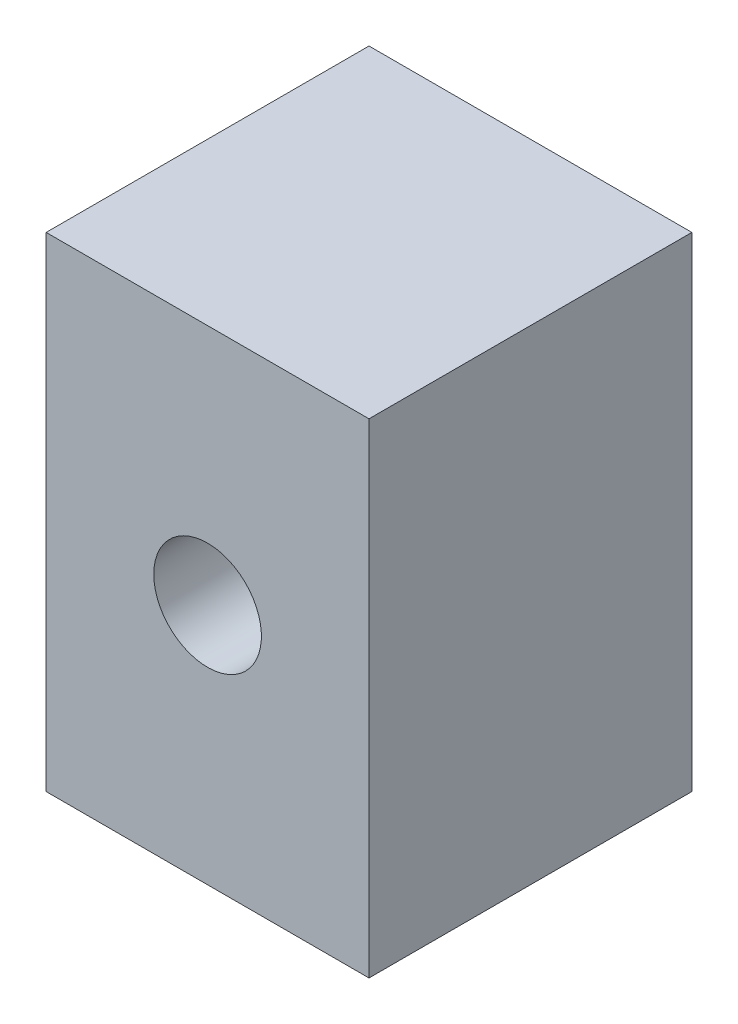
ISO-10303-21;
HEADER;
FILE_DESCRIPTION(('STEP AP214'),'2;1');
FILE_NAME('part.step','',(''),(''),'','','');
FILE_SCHEMA(('AUTOMOTIVE_DESIGN { 1 0 10303 214 1 1 1 1 }'));
ENDSEC;
DATA;
#1=APPLICATION_CONTEXT('core data for automotive mechanical design processes');
#2=APPLICATION_PROTOCOL_DEFINITION('international standard','automotive_design',2000,#1);
#3=PRODUCT_CONTEXT('',#1,'mechanical');
#4=PRODUCT('Part','Part','',(#3));
#5=PRODUCT_RELATED_PRODUCT_CATEGORY('part','',(#4));
#6=PRODUCT_DEFINITION_FORMATION('','',#4);
#7=PRODUCT_DEFINITION_CONTEXT('part definition',#1,'design');
#8=PRODUCT_DEFINITION('design','',#6,#7);
#9=PRODUCT_DEFINITION_SHAPE('','',#8);
#10=(LENGTH_UNIT() NAMED_UNIT(*) SI_UNIT(.MILLI.,.METRE.));
#11=(NAMED_UNIT(*) PLANE_ANGLE_UNIT() SI_UNIT($,.RADIAN.));
#12=(NAMED_UNIT(*) SI_UNIT($,.STERADIAN.) SOLID_ANGLE_UNIT());
#13=UNCERTAINTY_MEASURE_WITH_UNIT(LENGTH_MEASURE(1.E-05),#10,'distance_accuracy_value','');
#14=(GEOMETRIC_REPRESENTATION_CONTEXT(3) GLOBAL_UNCERTAINTY_ASSIGNED_CONTEXT((#13)) GLOBAL_UNIT_ASSIGNED_CONTEXT((#10,
#11,#12)) REPRESENTATION_CONTEXT('',''));
#15=CARTESIAN_POINT('',(0.,0.,0.));
#16=DIRECTION('',(0.,0.,1.));
#17=DIRECTION('',(1.,0.,0.));
#18=AXIS2_PLACEMENT_3D('',#15,#16,#17);
#19=CARTESIAN_POINT('',(0.,0.,38.1));
#20=DIRECTION('',(0.,0.,-1.));
#21=DIRECTION('',(-1.,0.,0.));
#22=AXIS2_PLACEMENT_3D('',#19,#20,#21);
#23=PLANE('',#22);
#24=DIRECTION('',(0.,1.,0.));
#25=VECTOR('',#24,1.);
#26=CARTESIAN_POINT('',(38.1,-57.15,38.1));
#27=LINE('',#26,#25);
#28=CARTESIAN_POINT('',(38.1,-57.15,38.1));
#29=VERTEX_POINT('',#28);
#30=CARTESIAN_POINT('',(38.1,57.15,38.1));
#31=VERTEX_POINT('',#30);
#32=EDGE_CURVE('E85',#29,#31,#27,.T.);
#33=ORIENTED_EDGE('',*,*,#32,.T.);
#34=DIRECTION('',(-1.,0.,0.));
#35=VECTOR('',#34,1.);
#36=CARTESIAN_POINT('',(-38.1,57.15,38.1));
#37=LINE('',#36,#35);
#38=CARTESIAN_POINT('',(-38.1,57.15,38.1));
#39=VERTEX_POINT('',#38);
#40=EDGE_CURVE('E80',#31,#39,#37,.T.);
#41=ORIENTED_EDGE('',*,*,#40,.T.);
#42=DIRECTION('',(0.,-1.,0.));
#43=VECTOR('',#42,1.);
#44=CARTESIAN_POINT('',(-38.1,-57.15,38.1));
#45=LINE('',#44,#43);
#46=CARTESIAN_POINT('',(-38.1,-57.15,38.1));
#47=VERTEX_POINT('',#46);
#48=EDGE_CURVE('E83',#39,#47,#45,.T.);
#49=ORIENTED_EDGE('',*,*,#48,.T.);
#50=DIRECTION('',(1.,0.,0.));
#51=VECTOR('',#50,1.);
#52=CARTESIAN_POINT('',(-38.1,-57.15,38.1));
#53=LINE('',#52,#51);
#54=EDGE_CURVE('E50',#47,#29,#53,.T.);
#55=ORIENTED_EDGE('',*,*,#54,.T.);
#56=EDGE_LOOP('',(#33,#41,#49,#55));
#57=FACE_BOUND('',#56,.T.);
#58=CARTESIAN_POINT('',(0.,0.,38.1));
#59=DIRECTION('',(0.,0.,1.));
#60=DIRECTION('',(1.,0.,0.));
#61=AXIS2_PLACEMENT_3D('',#58,#59,#60);
#62=CIRCLE('',#61,12.7);
#63=CARTESIAN_POINT('',(-12.7,0.,38.1));
#64=VERTEX_POINT('',#63);
#65=EDGE_CURVE('E100',#64,#64,#62,.T.);
#66=ORIENTED_EDGE('',*,*,#65,.F.);
#67=EDGE_LOOP('',(#66));
#68=FACE_BOUND('',#67,.T.);
#69=ADVANCED_FACE('F33',(#57,#68),#23,.F.);
#70=CARTESIAN_POINT('',(0.,0.,-38.1));
#71=DIRECTION('',(0.,0.,-1.));
#72=DIRECTION('',(-1.,0.,0.));
#73=AXIS2_PLACEMENT_3D('',#70,#71,#72);
#74=PLANE('',#73);
#75=DIRECTION('',(0.,1.,0.));
#76=VECTOR('',#75,1.);
#77=CARTESIAN_POINT('',(38.1,-57.15,-38.1));
#78=LINE('',#77,#76);
#79=CARTESIAN_POINT('',(38.1,-57.15,-38.1));
#80=VERTEX_POINT('',#79);
#81=CARTESIAN_POINT('',(38.1,57.15,-38.1));
#82=VERTEX_POINT('',#81);
#83=EDGE_CURVE('E97',#80,#82,#78,.T.);
#84=ORIENTED_EDGE('',*,*,#83,.F.);
#85=DIRECTION('',(1.,0.,0.));
#86=VECTOR('',#85,1.);
#87=CARTESIAN_POINT('',(-38.1,-57.15,-38.1));
#88=LINE('',#87,#86);
#89=CARTESIAN_POINT('',(-38.1,-57.15,-38.1));
#90=VERTEX_POINT('',#89);
#91=EDGE_CURVE('E73',#90,#80,#88,.T.);
#92=ORIENTED_EDGE('',*,*,#91,.F.);
#93=DIRECTION('',(0.,-1.,0.));
#94=VECTOR('',#93,1.);
#95=CARTESIAN_POINT('',(-38.1,-57.15,-38.1));
#96=LINE('',#95,#94);
#97=CARTESIAN_POINT('',(-38.1,57.15,-38.1));
#98=VERTEX_POINT('',#97);
#99=EDGE_CURVE('E67',#98,#90,#96,.T.);
#100=ORIENTED_EDGE('',*,*,#99,.F.);
#101=DIRECTION('',(-1.,0.,0.));
#102=VECTOR('',#101,1.);
#103=CARTESIAN_POINT('',(-38.1,57.15,-38.1));
#104=LINE('',#103,#102);
#105=EDGE_CURVE('E89',#82,#98,#104,.T.);
#106=ORIENTED_EDGE('',*,*,#105,.F.);
#107=EDGE_LOOP('',(#84,#92,#100,#106));
#108=FACE_BOUND('',#107,.T.);
#109=CARTESIAN_POINT('',(0.,0.,-38.1));
#110=DIRECTION('',(0.,0.,1.));
#111=DIRECTION('',(1.,0.,0.));
#112=AXIS2_PLACEMENT_3D('',#109,#110,#111);
#113=CIRCLE('',#112,12.7);
#114=CARTESIAN_POINT('',(-12.7,0.,-38.1));
#115=VERTEX_POINT('',#114);
#116=EDGE_CURVE('E112',#115,#115,#113,.T.);
#117=ORIENTED_EDGE('',*,*,#116,.T.);
#118=EDGE_LOOP('',(#117));
#119=FACE_BOUND('',#118,.T.);
#120=ADVANCED_FACE('F108',(#108,#119),#74,.T.);
#121=CARTESIAN_POINT('',(38.1,-57.15,38.1));
#122=DIRECTION('',(-1.,0.,0.));
#123=DIRECTION('',(0.,0.,1.));
#124=AXIS2_PLACEMENT_3D('',#121,#122,#123);
#125=PLANE('',#124);
#126=ORIENTED_EDGE('',*,*,#83,.T.);
#127=DIRECTION('',(0.,0.,-1.));
#128=VECTOR('',#127,1.);
#129=CARTESIAN_POINT('',(38.1,57.15,38.1));
#130=LINE('',#129,#128);
#131=EDGE_CURVE('E11',#31,#82,#130,.T.);
#132=ORIENTED_EDGE('',*,*,#131,.F.);
#133=ORIENTED_EDGE('',*,*,#32,.F.);
#134=DIRECTION('',(0.,0.,-1.));
#135=VECTOR('',#134,1.);
#136=CARTESIAN_POINT('',(38.1,-57.15,38.1));
#137=LINE('',#136,#135);
#138=EDGE_CURVE('E93',#29,#80,#137,.T.);
#139=ORIENTED_EDGE('',*,*,#138,.T.);
#140=EDGE_LOOP('',(#126,#132,#133,#139));
#141=FACE_BOUND('',#140,.T.);
#142=ADVANCED_FACE('F35',(#141),#125,.F.);
#143=CARTESIAN_POINT('',(-38.1,57.15,38.1));
#144=DIRECTION('',(0.,-1.,0.));
#145=DIRECTION('',(0.,0.,-1.));
#146=AXIS2_PLACEMENT_3D('',#143,#144,#145);
#147=PLANE('',#146);
#148=ORIENTED_EDGE('',*,*,#105,.T.);
#149=DIRECTION('',(0.,0.,-1.));
#150=VECTOR('',#149,1.);
#151=CARTESIAN_POINT('',(-38.1,57.15,38.1));
#152=LINE('',#151,#150);
#153=EDGE_CURVE('E42',#39,#98,#152,.T.);
#154=ORIENTED_EDGE('',*,*,#153,.F.);
#155=ORIENTED_EDGE('',*,*,#40,.F.);
#156=ORIENTED_EDGE('',*,*,#131,.T.);
#157=EDGE_LOOP('',(#148,#154,#155,#156));
#158=FACE_BOUND('',#157,.T.);
#159=ADVANCED_FACE('F88',(#158),#147,.F.);
#160=CARTESIAN_POINT('',(-38.1,-57.15,38.1));
#161=DIRECTION('',(1.,0.,0.));
#162=DIRECTION('',(0.,0.,-1.));
#163=AXIS2_PLACEMENT_3D('',#160,#161,#162);
#164=PLANE('',#163);
#165=ORIENTED_EDGE('',*,*,#99,.T.);
#166=DIRECTION('',(0.,0.,-1.));
#167=VECTOR('',#166,1.);
#168=CARTESIAN_POINT('',(-38.1,-57.15,38.1));
#169=LINE('',#168,#167);
#170=EDGE_CURVE('E90',#47,#90,#169,.T.);
#171=ORIENTED_EDGE('',*,*,#170,.F.);
#172=ORIENTED_EDGE('',*,*,#48,.F.);
#173=ORIENTED_EDGE('',*,*,#153,.T.);
#174=EDGE_LOOP('',(#165,#171,#172,#173));
#175=FACE_BOUND('',#174,.T.);
#176=ADVANCED_FACE('F91',(#175),#164,.F.);
#177=CARTESIAN_POINT('',(-38.1,-57.15,38.1));
#178=DIRECTION('',(0.,1.,0.));
#179=DIRECTION('',(0.,0.,1.));
#180=AXIS2_PLACEMENT_3D('',#177,#178,#179);
#181=PLANE('',#180);
#182=ORIENTED_EDGE('',*,*,#91,.T.);
#183=ORIENTED_EDGE('',*,*,#138,.F.);
#184=ORIENTED_EDGE('',*,*,#54,.F.);
#185=ORIENTED_EDGE('',*,*,#170,.T.);
#186=EDGE_LOOP('',(#182,#183,#184,#185));
#187=FACE_BOUND('',#186,.T.);
#188=ADVANCED_FACE('F105',(#187),#181,.F.);
#189=CARTESIAN_POINT('',(0.,0.,38.1));
#190=DIRECTION('',(0.,0.,-1.));
#191=DIRECTION('',(-1.,0.,0.));
#192=AXIS2_PLACEMENT_3D('',#189,#190,#191);
#193=CYLINDRICAL_SURFACE('',#192,12.7);
#194=CARTESIAN_POINT('',(-12.7,0.,38.1));
#195=CARTESIAN_POINT('',(-12.7,0.,37.30625));
#196=CARTESIAN_POINT('',(-12.7,0.,36.5125));
#197=CARTESIAN_POINT('',(-12.7,0.,34.925));
#198=CARTESIAN_POINT('',(-12.7,0.,34.13125));
#199=CARTESIAN_POINT('',(-12.7,0.,32.54375));
#200=CARTESIAN_POINT('',(-12.7,0.,31.75));
#201=CARTESIAN_POINT('',(-12.7,0.,30.1625));
#202=CARTESIAN_POINT('',(-12.7,0.,29.36875));
#203=CARTESIAN_POINT('',(-12.7,0.,27.78125));
#204=CARTESIAN_POINT('',(-12.7,0.,26.9875));
#205=CARTESIAN_POINT('',(-12.7,0.,25.4));
#206=CARTESIAN_POINT('',(-12.7,0.,24.60625));
#207=CARTESIAN_POINT('',(-12.7,0.,23.01875));
#208=CARTESIAN_POINT('',(-12.7,0.,22.225));
#209=CARTESIAN_POINT('',(-12.7,0.,20.6375));
#210=CARTESIAN_POINT('',(-12.7,0.,19.84375));
#211=CARTESIAN_POINT('',(-12.7,0.,18.25625));
#212=CARTESIAN_POINT('',(-12.7,0.,17.4625));
#213=CARTESIAN_POINT('',(-12.7,0.,15.875));
#214=CARTESIAN_POINT('',(-12.7,0.,15.08125));
#215=CARTESIAN_POINT('',(-12.7,0.,13.49375));
#216=CARTESIAN_POINT('',(-12.7,0.,12.7));
#217=CARTESIAN_POINT('',(-12.7,0.,11.1125));
#218=CARTESIAN_POINT('',(-12.7,0.,10.31875));
#219=CARTESIAN_POINT('',(-12.7,0.,8.73124999999999));
#220=CARTESIAN_POINT('',(-12.7,0.,7.93749999999999));
#221=CARTESIAN_POINT('',(-12.7,0.,6.34999999999999));
#222=CARTESIAN_POINT('',(-12.7,0.,5.55625));
#223=CARTESIAN_POINT('',(-12.7,0.,3.96875));
#224=CARTESIAN_POINT('',(-12.7,0.,3.17499999999999));
#225=CARTESIAN_POINT('',(-12.7,0.,1.58749999999999));
#226=CARTESIAN_POINT('',(-12.7,0.,0.793749999999994));
#227=CARTESIAN_POINT('',(-12.7,0.,-0.793750000000007));
#228=CARTESIAN_POINT('',(-12.7,0.,-1.58750000000001));
#229=CARTESIAN_POINT('',(-12.7,0.,-3.17500000000001));
#230=CARTESIAN_POINT('',(-12.7,0.,-3.96875000000001));
#231=CARTESIAN_POINT('',(-12.7,0.,-5.55625000000001));
#232=CARTESIAN_POINT('',(-12.7,0.,-6.35000000000001));
#233=CARTESIAN_POINT('',(-12.7,0.,-7.93750000000001));
#234=CARTESIAN_POINT('',(-12.7,0.,-8.73125000000001));
#235=CARTESIAN_POINT('',(-12.7,0.,-10.31875));
#236=CARTESIAN_POINT('',(-12.7,0.,-11.1125));
#237=CARTESIAN_POINT('',(-12.7,0.,-12.7));
#238=CARTESIAN_POINT('',(-12.7,0.,-13.49375));
#239=CARTESIAN_POINT('',(-12.7,0.,-15.08125));
#240=CARTESIAN_POINT('',(-12.7,0.,-15.875));
#241=CARTESIAN_POINT('',(-12.7,0.,-17.4625));
#242=CARTESIAN_POINT('',(-12.7,0.,-18.25625));
#243=CARTESIAN_POINT('',(-12.7,0.,-19.84375));
#244=CARTESIAN_POINT('',(-12.7,0.,-20.6375));
#245=CARTESIAN_POINT('',(-12.7,0.,-22.225));
#246=CARTESIAN_POINT('',(-12.7,0.,-23.01875));
#247=CARTESIAN_POINT('',(-12.7,0.,-24.60625));
#248=CARTESIAN_POINT('',(-12.7,0.,-25.4));
#249=CARTESIAN_POINT('',(-12.7,0.,-26.9875));
#250=CARTESIAN_POINT('',(-12.7,0.,-27.78125));
#251=CARTESIAN_POINT('',(-12.7,0.,-29.36875));
#252=CARTESIAN_POINT('',(-12.7,0.,-30.1625));
#253=CARTESIAN_POINT('',(-12.7,0.,-31.75));
#254=CARTESIAN_POINT('',(-12.7,0.,-32.54375));
#255=CARTESIAN_POINT('',(-12.7,0.,-34.13125));
#256=CARTESIAN_POINT('',(-12.7,0.,-34.925));
#257=CARTESIAN_POINT('',(-12.7,0.,-36.5125));
#258=CARTESIAN_POINT('',(-12.7,0.,-37.30625));
#259=CARTESIAN_POINT('',(-12.7,0.,-38.1));
#260=B_SPLINE_CURVE_WITH_KNOTS('',3,(#194,#195,#196,#197,#198,#199,#200,#201,#202,#203,#204,
#205,#206,#207,#208,#209,#210,#211,#212,#213,#214,#215,#216,#217,#218,#219,#220,#221,#222,#223,
#224,#225,#226,#227,#228,#229,#230,#231,#232,#233,#234,#235,#236,#237,#238,#239,#240,#241,#242,
#243,#244,#245,#246,#247,#248,#249,#250,#251,#252,#253,#254,#255,#256,#257,#258,#259),
.UNSPECIFIED.,.F.,.F.,(4,2,2,2,2,2,2,2,2,2,2,2,2,2,2,2,2,2,2,2,2,2,2,2,2,2,2,2,2,2,2,2,4),(0.,
2.38124999999999,4.7625,7.14375,9.525,11.90625,14.2875,16.66875,19.05,21.43125,23.8125,26.19375,
28.575,30.95625,33.3375,35.71875,38.1,40.48125,42.8625,45.24375,47.625,50.00625,52.3875,
54.76875,57.15,59.53125,61.9125,64.29375,66.675,69.05625,71.4375,73.81875,76.2),.UNSPECIFIED.);
#261=EDGE_CURVE('BSEAM118',#64,#115,#260,.T.);
#262=ORIENTED_EDGE('',*,*,#65,.T.);
#263=ORIENTED_EDGE('',*,*,#116,.F.);
#264=ORIENTED_EDGE('',*,*,#261,.T.);
#265=ORIENTED_EDGE('',*,*,#261,.F.);
#266=EDGE_LOOP('',(#262,#264,#263,#265));
#267=FACE_BOUND('',#266,.T.);
#268=ADVANCED_FACE('F118',(#267),#193,.F.);
#269=CLOSED_SHELL('',(#69,#120,#142,#159,#176,#188,#268));
#270=MANIFOLD_SOLID_BREP('B2',#269);
#271=ADVANCED_BREP_SHAPE_REPRESENTATION('',(#18,#270),#14);
#272=SHAPE_DEFINITION_REPRESENTATION(#9,#271);
ENDSEC;
END-ISO-10303-21;
